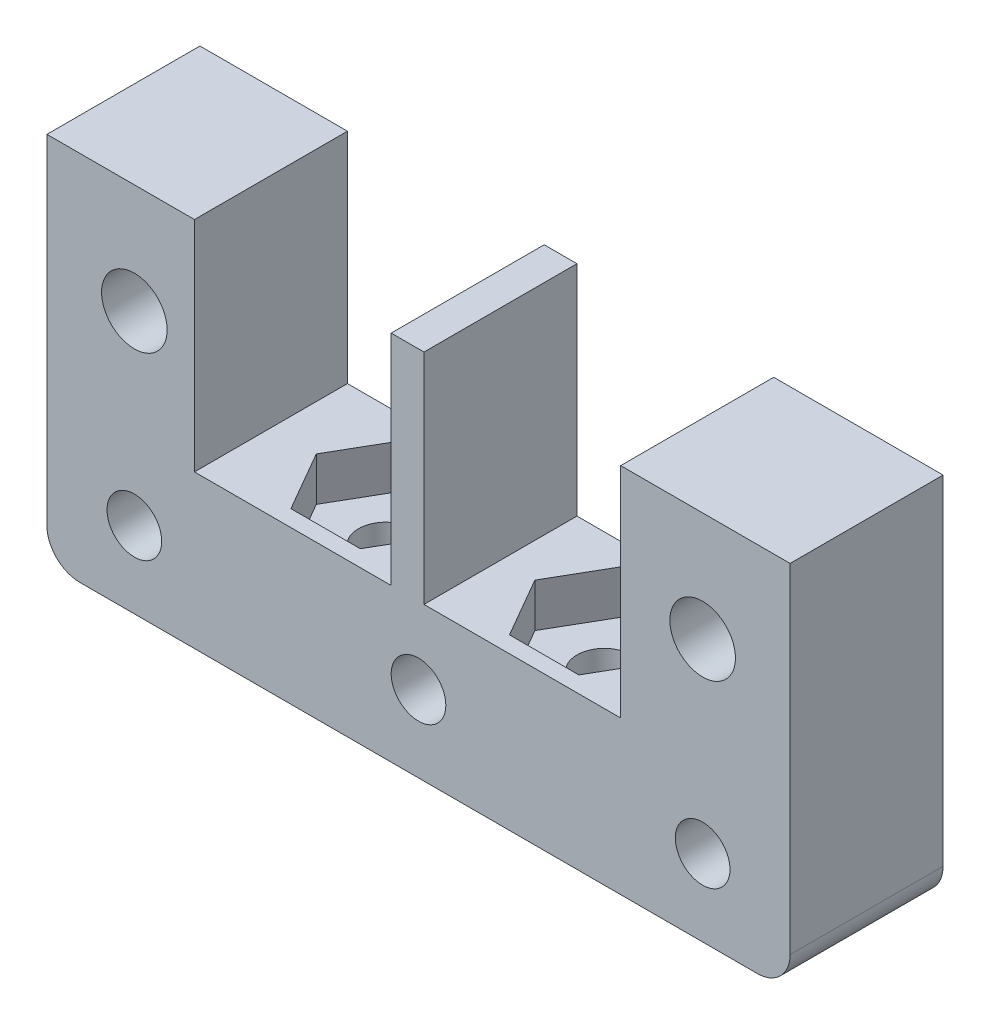
ISO-10303-21;
HEADER;
FILE_DESCRIPTION(('STEP AP214'),'2;1');
FILE_NAME('part.step','',(''),(''),'','','');
FILE_SCHEMA(('AUTOMOTIVE_DESIGN { 1 0 10303 214 1 1 1 1 }'));
ENDSEC;
DATA;
#1=APPLICATION_CONTEXT('core data for automotive mechanical design processes');
#2=APPLICATION_PROTOCOL_DEFINITION('international standard','automotive_design',2000,#1);
#3=PRODUCT_CONTEXT('',#1,'mechanical');
#4=PRODUCT('Part','Part','',(#3));
#5=PRODUCT_RELATED_PRODUCT_CATEGORY('part','',(#4));
#6=PRODUCT_DEFINITION_FORMATION('','',#4);
#7=PRODUCT_DEFINITION_CONTEXT('part definition',#1,'design');
#8=PRODUCT_DEFINITION('design','',#6,#7);
#9=PRODUCT_DEFINITION_SHAPE('','',#8);
#10=(LENGTH_UNIT() NAMED_UNIT(*) SI_UNIT(.MILLI.,.METRE.));
#11=(NAMED_UNIT(*) PLANE_ANGLE_UNIT() SI_UNIT($,.RADIAN.));
#12=(NAMED_UNIT(*) SI_UNIT($,.STERADIAN.) SOLID_ANGLE_UNIT());
#13=UNCERTAINTY_MEASURE_WITH_UNIT(LENGTH_MEASURE(1.E-05),#10,'distance_accuracy_value','');
#14=(GEOMETRIC_REPRESENTATION_CONTEXT(3) GLOBAL_UNCERTAINTY_ASSIGNED_CONTEXT((#13)) GLOBAL_UNIT_ASSIGNED_CONTEXT((#10,
#11,#12)) REPRESENTATION_CONTEXT('',''));
#15=CARTESIAN_POINT('',(0.,0.,0.));
#16=DIRECTION('',(0.,0.,1.));
#17=DIRECTION('',(1.,0.,0.));
#18=AXIS2_PLACEMENT_3D('',#15,#16,#17);
#19=CARTESIAN_POINT('',(12.,10.,3.5));
#20=DIRECTION('',(0.,-1.,0.));
#21=DIRECTION('',(0.,0.,-1.));
#22=AXIS2_PLACEMENT_3D('',#19,#20,#21);
#23=CYLINDRICAL_SURFACE('',#22,1.25);
#24=CARTESIAN_POINT('',(12.,0.,3.5));
#25=DIRECTION('',(0.,-1.,0.));
#26=DIRECTION('',(0.,0.,-1.));
#27=AXIS2_PLACEMENT_3D('',#24,#25,#26);
#28=CIRCLE('',#27,1.25);
#29=CARTESIAN_POINT('',(12.,0.,2.25));
#30=VERTEX_POINT('',#29);
#31=EDGE_CURVE('E399',#30,#30,#28,.T.);
#32=ORIENTED_EDGE('',*,*,#31,.T.);
#33=EDGE_LOOP('',(#32));
#34=FACE_BOUND('',#33,.T.);
#35=CARTESIAN_POINT('',(12.,5.,3.5));
#36=DIRECTION('',(0.,1.,0.));
#37=DIRECTION('',(0.,0.,1.));
#38=AXIS2_PLACEMENT_3D('',#35,#36,#37);
#39=CIRCLE('',#38,1.25);
#40=CARTESIAN_POINT('',(12.,5.,4.75));
#41=VERTEX_POINT('',#40);
#42=EDGE_CURVE('E346',#41,#41,#39,.F.);
#43=ORIENTED_EDGE('',*,*,#42,.F.);
#44=EDGE_LOOP('',(#43));
#45=FACE_BOUND('',#44,.T.);
#46=ADVANCED_FACE('F45',(#34,#45),#23,.F.);
#47=CARTESIAN_POINT('',(22.,10.,3.5));
#48=DIRECTION('',(0.,-1.,0.));
#49=DIRECTION('',(0.,0.,-1.));
#50=AXIS2_PLACEMENT_3D('',#47,#48,#49);
#51=CYLINDRICAL_SURFACE('',#50,1.25);
#52=CARTESIAN_POINT('',(22.,0.,3.5));
#53=DIRECTION('',(0.,-1.,0.));
#54=DIRECTION('',(0.,0.,-1.));
#55=AXIS2_PLACEMENT_3D('',#52,#53,#54);
#56=CIRCLE('',#55,1.25);
#57=CARTESIAN_POINT('',(22.,0.,2.25));
#58=VERTEX_POINT('',#57);
#59=EDGE_CURVE('E400',#58,#58,#56,.T.);
#60=ORIENTED_EDGE('',*,*,#59,.T.);
#61=EDGE_LOOP('',(#60));
#62=FACE_BOUND('',#61,.T.);
#63=CARTESIAN_POINT('',(22.,5.,3.5));
#64=DIRECTION('',(0.,1.,0.));
#65=DIRECTION('',(0.,0.,1.));
#66=AXIS2_PLACEMENT_3D('',#63,#64,#65);
#67=CIRCLE('',#66,1.25);
#68=CARTESIAN_POINT('',(22.,5.,4.75));
#69=VERTEX_POINT('',#68);
#70=EDGE_CURVE('E276',#69,#69,#67,.F.);
#71=ORIENTED_EDGE('',*,*,#70,.F.);
#72=EDGE_LOOP('',(#71));
#73=FACE_BOUND('',#72,.T.);
#74=ADVANCED_FACE('F525',(#62,#73),#51,.F.);
#75=CARTESIAN_POINT('',(0.,7.,7.));
#76=DIRECTION('',(0.,-1.,0.));
#77=DIRECTION('',(0.,0.,-1.));
#78=AXIS2_PLACEMENT_3D('',#75,#76,#77);
#79=PLANE('',#78);
#80=DIRECTION('',(-0.500000000000001,0.,-0.866025403784438));
#81=VECTOR('',#80,1.);
#82=CARTESIAN_POINT('',(25.1754264805429,7.,3.5));
#83=LINE('',#82,#81);
#84=CARTESIAN_POINT('',(25.1754264805429,7.,3.5));
#85=VERTEX_POINT('',#84);
#86=CARTESIAN_POINT('',(23.5877132402715,7.,0.749999999999997));
#87=VERTEX_POINT('',#86);
#88=EDGE_CURVE('E306',#85,#87,#83,.T.);
#89=ORIENTED_EDGE('',*,*,#88,.F.);
#90=DIRECTION('',(0.5,0.,-0.866025403784438));
#91=VECTOR('',#90,1.);
#92=CARTESIAN_POINT('',(23.5877132402715,7.,6.25));
#93=LINE('',#92,#91);
#94=CARTESIAN_POINT('',(23.5877132402715,7.,6.25));
#95=VERTEX_POINT('',#94);
#96=EDGE_CURVE('E304',#95,#85,#93,.T.);
#97=ORIENTED_EDGE('',*,*,#96,.F.);
#98=DIRECTION('',(1.,0.,0.));
#99=VECTOR('',#98,1.);
#100=CARTESIAN_POINT('',(20.4122867597285,7.,6.25));
#101=LINE('',#100,#99);
#102=CARTESIAN_POINT('',(20.4122867597285,7.,6.25));
#103=VERTEX_POINT('',#102);
#104=EDGE_CURVE('E288',#103,#95,#101,.T.);
#105=ORIENTED_EDGE('',*,*,#104,.F.);
#106=DIRECTION('',(0.5,0.,0.866025403784438));
#107=VECTOR('',#106,1.);
#108=CARTESIAN_POINT('',(18.8245735194571,7.,3.5));
#109=LINE('',#108,#107);
#110=CARTESIAN_POINT('',(18.8245735194571,7.,3.5));
#111=VERTEX_POINT('',#110);
#112=EDGE_CURVE('E315',#111,#103,#109,.T.);
#113=ORIENTED_EDGE('',*,*,#112,.F.);
#114=DIRECTION('',(-0.5,0.,0.866025403784439));
#115=VECTOR('',#114,1.);
#116=CARTESIAN_POINT('',(20.4122867597285,7.,0.749999999999998));
#117=LINE('',#116,#115);
#118=CARTESIAN_POINT('',(20.4122867597285,7.,0.749999999999998));
#119=VERTEX_POINT('',#118);
#120=EDGE_CURVE('E312',#119,#111,#117,.T.);
#121=ORIENTED_EDGE('',*,*,#120,.F.);
#122=DIRECTION('',(-1.,0.,0.));
#123=VECTOR('',#122,1.);
#124=CARTESIAN_POINT('',(23.5877132402715,7.,0.749999999999997));
#125=LINE('',#124,#123);
#126=EDGE_CURVE('E309',#87,#119,#125,.T.);
#127=ORIENTED_EDGE('',*,*,#126,.F.);
#128=EDGE_LOOP('',(#89,#97,#105,#113,#121,#127));
#129=FACE_BOUND('',#128,.T.);
#130=DIRECTION('',(0.,0.,1.));
#131=VECTOR('',#130,1.);
#132=CARTESIAN_POINT('',(26.25,7.,0.));
#133=LINE('',#132,#131);
#134=CARTESIAN_POINT('',(26.25,7.,0.));
#135=VERTEX_POINT('',#134);
#136=CARTESIAN_POINT('',(26.25,7.,7.));
#137=VERTEX_POINT('',#136);
#138=EDGE_CURVE('E335',#135,#137,#133,.T.);
#139=ORIENTED_EDGE('',*,*,#138,.F.);
#140=DIRECTION('',(-1.,0.,0.));
#141=VECTOR('',#140,1.);
#142=CARTESIAN_POINT('',(0.,7.,0.));
#143=LINE('',#142,#141);
#144=CARTESIAN_POINT('',(17.25,7.,0.));
#145=VERTEX_POINT('',#144);
#146=EDGE_CURVE('E427',#135,#145,#143,.T.);
#147=ORIENTED_EDGE('',*,*,#146,.T.);
#148=DIRECTION('',(0.,0.,-1.));
#149=VECTOR('',#148,1.);
#150=CARTESIAN_POINT('',(17.25,7.,7.));
#151=LINE('',#150,#149);
#152=CARTESIAN_POINT('',(17.25,7.,7.));
#153=VERTEX_POINT('',#152);
#154=EDGE_CURVE('E357',#153,#145,#151,.T.);
#155=ORIENTED_EDGE('',*,*,#154,.F.);
#156=DIRECTION('',(-1.,0.,0.));
#157=VECTOR('',#156,1.);
#158=CARTESIAN_POINT('',(0.,7.,7.));
#159=LINE('',#158,#157);
#160=EDGE_CURVE('E432',#137,#153,#159,.T.);
#161=ORIENTED_EDGE('',*,*,#160,.F.);
#162=EDGE_LOOP('',(#139,#147,#155,#161));
#163=FACE_BOUND('',#162,.T.);
#164=ADVANCED_FACE('F501',(#129,#163),#79,.F.);
#165=DIRECTION('',(-0.5,0.,-0.866025403784439));
#166=VECTOR('',#165,1.);
#167=CARTESIAN_POINT('',(15.1754264805429,7.,3.49999999999999));
#168=LINE('',#167,#166);
#169=CARTESIAN_POINT('',(15.1754264805429,7.,3.49999999999999));
#170=VERTEX_POINT('',#169);
#171=CARTESIAN_POINT('',(13.5877132402715,7.,0.749999999999999));
#172=VERTEX_POINT('',#171);
#173=EDGE_CURVE('E263',#170,#172,#168,.T.);
#174=ORIENTED_EDGE('',*,*,#173,.F.);
#175=DIRECTION('',(0.5,0.,-0.866025403784439));
#176=VECTOR('',#175,1.);
#177=CARTESIAN_POINT('',(13.5877132402715,7.,6.25));
#178=LINE('',#177,#176);
#179=CARTESIAN_POINT('',(13.5877132402715,7.,6.25));
#180=VERTEX_POINT('',#179);
#181=EDGE_CURVE('E227',#180,#170,#178,.T.);
#182=ORIENTED_EDGE('',*,*,#181,.F.);
#183=DIRECTION('',(1.,0.,0.));
#184=VECTOR('',#183,1.);
#185=CARTESIAN_POINT('',(10.4122867597285,7.,6.25));
#186=LINE('',#185,#184);
#187=CARTESIAN_POINT('',(10.4122867597285,7.,6.25));
#188=VERTEX_POINT('',#187);
#189=EDGE_CURVE('E246',#188,#180,#186,.T.);
#190=ORIENTED_EDGE('',*,*,#189,.F.);
#191=DIRECTION('',(0.5,0.,0.866025403784439));
#192=VECTOR('',#191,1.);
#193=CARTESIAN_POINT('',(8.82457351945707,7.,3.5));
#194=LINE('',#193,#192);
#195=CARTESIAN_POINT('',(8.82457351945707,7.,3.5));
#196=VERTEX_POINT('',#195);
#197=EDGE_CURVE('E249',#196,#188,#194,.T.);
#198=ORIENTED_EDGE('',*,*,#197,.F.);
#199=DIRECTION('',(-0.499999999999999,0.,0.866025403784439));
#200=VECTOR('',#199,1.);
#201=CARTESIAN_POINT('',(10.4122867597285,7.,0.75));
#202=LINE('',#201,#200);
#203=CARTESIAN_POINT('',(10.4122867597285,7.,0.75));
#204=VERTEX_POINT('',#203);
#205=EDGE_CURVE('E269',#204,#196,#202,.T.);
#206=ORIENTED_EDGE('',*,*,#205,.F.);
#207=DIRECTION('',(-1.,0.,0.));
#208=VECTOR('',#207,1.);
#209=CARTESIAN_POINT('',(13.5877132402715,7.,0.749999999999999));
#210=LINE('',#209,#208);
#211=EDGE_CURVE('E266',#172,#204,#210,.T.);
#212=ORIENTED_EDGE('',*,*,#211,.F.);
#213=EDGE_LOOP('',(#174,#182,#190,#198,#206,#212));
#214=FACE_BOUND('',#213,.T.);
#215=DIRECTION('',(0.,0.,1.));
#216=VECTOR('',#215,1.);
#217=CARTESIAN_POINT('',(15.75,7.,7.));
#218=LINE('',#217,#216);
#219=CARTESIAN_POINT('',(15.75,7.,0.));
#220=VERTEX_POINT('',#219);
#221=CARTESIAN_POINT('',(15.75,7.,7.));
#222=VERTEX_POINT('',#221);
#223=EDGE_CURVE('E352',#220,#222,#218,.T.);
#224=ORIENTED_EDGE('',*,*,#223,.F.);
#225=CARTESIAN_POINT('',(6.75,7.,0.));
#226=VERTEX_POINT('',#225);
#227=EDGE_CURVE('E441',#220,#226,#143,.T.);
#228=ORIENTED_EDGE('',*,*,#227,.T.);
#229=DIRECTION('',(0.,0.,-1.));
#230=VECTOR('',#229,1.);
#231=CARTESIAN_POINT('',(6.75,7.,0.));
#232=LINE('',#231,#230);
#233=CARTESIAN_POINT('',(6.75,7.,7.));
#234=VERTEX_POINT('',#233);
#235=EDGE_CURVE('E379',#234,#226,#232,.T.);
#236=ORIENTED_EDGE('',*,*,#235,.F.);
#237=EDGE_CURVE('E431',#222,#234,#159,.T.);
#238=ORIENTED_EDGE('',*,*,#237,.F.);
#239=EDGE_LOOP('',(#224,#228,#236,#238));
#240=FACE_BOUND('',#239,.T.);
#241=ADVANCED_FACE('F486',(#214,#240),#79,.F.);
#242=CARTESIAN_POINT('',(0.,0.,7.));
#243=DIRECTION('',(0.,0.,1.));
#244=DIRECTION('',(1.,0.,0.));
#245=AXIS2_PLACEMENT_3D('',#242,#243,#244);
#246=PLANE('',#245);
#247=CARTESIAN_POINT('',(30.,12.,7.));
#248=DIRECTION('',(0.,0.,1.));
#249=DIRECTION('',(1.,0.,0.));
#250=AXIS2_PLACEMENT_3D('',#247,#248,#249);
#251=CIRCLE('',#250,1.5);
#252=CARTESIAN_POINT('',(31.5,12.,7.));
#253=VERTEX_POINT('',#252);
#254=EDGE_CURVE('E252',#253,#253,#251,.T.);
#255=ORIENTED_EDGE('',*,*,#254,.F.);
#256=EDGE_LOOP('',(#255));
#257=FACE_BOUND('',#256,.T.);
#258=CARTESIAN_POINT('',(4.,12.,7.));
#259=DIRECTION('',(0.,0.,1.));
#260=DIRECTION('',(1.,0.,0.));
#261=AXIS2_PLACEMENT_3D('',#258,#259,#260);
#262=CIRCLE('',#261,1.5);
#263=CARTESIAN_POINT('',(5.5,12.,7.));
#264=VERTEX_POINT('',#263);
#265=EDGE_CURVE('E781',#264,#264,#262,.T.);
#266=ORIENTED_EDGE('',*,*,#265,.F.);
#267=EDGE_LOOP('',(#266));
#268=FACE_BOUND('',#267,.T.);
#269=CARTESIAN_POINT('',(30.,3.50000000000001,7.));
#270=DIRECTION('',(0.,0.,1.));
#271=DIRECTION('',(1.,0.,0.));
#272=AXIS2_PLACEMENT_3D('',#269,#270,#271);
#273=CIRCLE('',#272,1.25);
#274=CARTESIAN_POINT('',(31.25,3.50000000000001,7.));
#275=VERTEX_POINT('',#274);
#276=EDGE_CURVE('E412',#275,#275,#273,.T.);
#277=ORIENTED_EDGE('',*,*,#276,.F.);
#278=EDGE_LOOP('',(#277));
#279=FACE_BOUND('',#278,.T.);
#280=DIRECTION('',(0.,-1.,0.));
#281=VECTOR('',#280,1.);
#282=CARTESIAN_POINT('',(0.,7.,7.));
#283=LINE('',#282,#281);
#284=CARTESIAN_POINT('',(0.,17.,7.));
#285=VERTEX_POINT('',#284);
#286=CARTESIAN_POINT('',(0.,1.5,7.));
#287=VERTEX_POINT('',#286);
#288=EDGE_CURVE('E424',#285,#287,#283,.T.);
#289=ORIENTED_EDGE('',*,*,#288,.T.);
#290=CARTESIAN_POINT('',(1.5,1.5,7.));
#291=DIRECTION('',(0.,0.,1.));
#292=DIRECTION('',(1.,0.,0.));
#293=AXIS2_PLACEMENT_3D('',#290,#291,#292);
#294=CIRCLE('',#293,1.5);
#295=CARTESIAN_POINT('',(1.5,0.,7.));
#296=VERTEX_POINT('',#295);
#297=EDGE_CURVE('E53',#287,#296,#294,.T.);
#298=ORIENTED_EDGE('',*,*,#297,.T.);
#299=DIRECTION('',(1.,0.,0.));
#300=VECTOR('',#299,1.);
#301=CARTESIAN_POINT('',(0.,0.,7.));
#302=LINE('',#301,#300);
#303=CARTESIAN_POINT('',(32.5,0.,7.));
#304=VERTEX_POINT('',#303);
#305=EDGE_CURVE('E426',#296,#304,#302,.T.);
#306=ORIENTED_EDGE('',*,*,#305,.T.);
#307=CARTESIAN_POINT('',(32.5,1.5,7.));
#308=DIRECTION('',(0.,0.,1.));
#309=DIRECTION('',(1.,0.,0.));
#310=AXIS2_PLACEMENT_3D('',#307,#308,#309);
#311=CIRCLE('',#310,1.5);
#312=CARTESIAN_POINT('',(34.,1.5,7.));
#313=VERTEX_POINT('',#312);
#314=EDGE_CURVE('E60',#304,#313,#311,.T.);
#315=ORIENTED_EDGE('',*,*,#314,.T.);
#316=DIRECTION('',(0.,1.,0.));
#317=VECTOR('',#316,1.);
#318=CARTESIAN_POINT('',(34.,0.,7.));
#319=LINE('',#318,#317);
#320=CARTESIAN_POINT('',(34.,17.,7.00000000000004));
#321=VERTEX_POINT('',#320);
#322=EDGE_CURVE('E429',#313,#321,#319,.T.);
#323=ORIENTED_EDGE('',*,*,#322,.T.);
#324=DIRECTION('',(1.,0.,0.));
#325=VECTOR('',#324,1.);
#326=CARTESIAN_POINT('',(26.25,17.,7.00000000000004));
#327=LINE('',#326,#325);
#328=CARTESIAN_POINT('',(26.25,17.,7.00000000000004));
#329=VERTEX_POINT('',#328);
#330=EDGE_CURVE('E334',#329,#321,#327,.T.);
#331=ORIENTED_EDGE('',*,*,#330,.F.);
#332=DIRECTION('',(0.,-1.,0.));
#333=VECTOR('',#332,1.);
#334=CARTESIAN_POINT('',(26.25,17.,7.00000000000004));
#335=LINE('',#334,#333);
#336=EDGE_CURVE('E349',#329,#137,#335,.T.);
#337=ORIENTED_EDGE('',*,*,#336,.T.);
#338=ORIENTED_EDGE('',*,*,#160,.T.);
#339=DIRECTION('',(0.,-1.,0.));
#340=VECTOR('',#339,1.);
#341=CARTESIAN_POINT('',(17.25,17.,7.));
#342=LINE('',#341,#340);
#343=CARTESIAN_POINT('',(17.25,17.,7.));
#344=VERTEX_POINT('',#343);
#345=EDGE_CURVE('E373',#344,#153,#342,.T.);
#346=ORIENTED_EDGE('',*,*,#345,.F.);
#347=DIRECTION('',(1.,0.,0.));
#348=VECTOR('',#347,1.);
#349=CARTESIAN_POINT('',(15.75,17.,7.));
#350=LINE('',#349,#348);
#351=CARTESIAN_POINT('',(15.75,17.,7.));
#352=VERTEX_POINT('',#351);
#353=EDGE_CURVE('E356',#352,#344,#350,.T.);
#354=ORIENTED_EDGE('',*,*,#353,.F.);
#355=DIRECTION('',(0.,-1.,0.));
#356=VECTOR('',#355,1.);
#357=CARTESIAN_POINT('',(15.75,17.,7.));
#358=LINE('',#357,#356);
#359=EDGE_CURVE('E376',#352,#222,#358,.T.);
#360=ORIENTED_EDGE('',*,*,#359,.T.);
#361=ORIENTED_EDGE('',*,*,#237,.T.);
#362=DIRECTION('',(0.,-1.,0.));
#363=VECTOR('',#362,1.);
#364=CARTESIAN_POINT('',(6.75000000000001,17.,7.));
#365=LINE('',#364,#363);
#366=CARTESIAN_POINT('',(6.75000000000001,17.,7.));
#367=VERTEX_POINT('',#366);
#368=EDGE_CURVE('E391',#367,#234,#365,.T.);
#369=ORIENTED_EDGE('',*,*,#368,.F.);
#370=DIRECTION('',(1.,0.,0.));
#371=VECTOR('',#370,1.);
#372=CARTESIAN_POINT('',(6.75000000000001,17.,7.));
#373=LINE('',#372,#371);
#374=EDGE_CURVE('E389',#285,#367,#373,.T.);
#375=ORIENTED_EDGE('',*,*,#374,.F.);
#376=EDGE_LOOP('',(#289,#298,#306,#315,#323,#331,#337,#338,#346,#354,#360,#361,#369,#375));
#377=FACE_BOUND('',#376,.T.);
#378=CARTESIAN_POINT('',(4.,3.5,7.));
#379=DIRECTION('',(0.,0.,1.));
#380=DIRECTION('',(1.,0.,0.));
#381=AXIS2_PLACEMENT_3D('',#378,#379,#380);
#382=CIRCLE('',#381,1.25);
#383=CARTESIAN_POINT('',(5.25,3.5,7.));
#384=VERTEX_POINT('',#383);
#385=EDGE_CURVE('E418',#384,#384,#382,.T.);
#386=ORIENTED_EDGE('',*,*,#385,.F.);
#387=EDGE_LOOP('',(#386));
#388=FACE_BOUND('',#387,.T.);
#389=CARTESIAN_POINT('',(17.,3.5,7.));
#390=DIRECTION('',(0.,0.,1.));
#391=DIRECTION('',(1.,0.,0.));
#392=AXIS2_PLACEMENT_3D('',#389,#390,#391);
#393=CIRCLE('',#392,1.25);
#394=CARTESIAN_POINT('',(18.25,3.5,7.));
#395=VERTEX_POINT('',#394);
#396=EDGE_CURVE('E406',#395,#395,#393,.T.);
#397=ORIENTED_EDGE('',*,*,#396,.F.);
#398=EDGE_LOOP('',(#397));
#399=FACE_BOUND('',#398,.T.);
#400=ADVANCED_FACE('F458',(#257,#268,#279,#377,#388,#399),#246,.T.);
#401=CARTESIAN_POINT('',(0.,0.,0.));
#402=DIRECTION('',(0.,0.,1.));
#403=DIRECTION('',(1.,0.,0.));
#404=AXIS2_PLACEMENT_3D('',#401,#402,#403);
#405=PLANE('',#404);
#406=CARTESIAN_POINT('',(30.,12.,0.));
#407=DIRECTION('',(0.,0.,-1.));
#408=DIRECTION('',(-1.,0.,0.));
#409=AXIS2_PLACEMENT_3D('',#406,#407,#408);
#410=CIRCLE('',#409,1.5);
#411=CARTESIAN_POINT('',(28.5,12.,0.));
#412=VERTEX_POINT('',#411);
#413=EDGE_CURVE('E780',#412,#412,#410,.T.);
#414=ORIENTED_EDGE('',*,*,#413,.F.);
#415=EDGE_LOOP('',(#414));
#416=FACE_BOUND('',#415,.T.);
#417=CARTESIAN_POINT('',(4.,12.,0.));
#418=DIRECTION('',(0.,0.,-1.));
#419=DIRECTION('',(-1.,0.,0.));
#420=AXIS2_PLACEMENT_3D('',#417,#418,#419);
#421=CIRCLE('',#420,1.5);
#422=CARTESIAN_POINT('',(2.5,12.,0.));
#423=VERTEX_POINT('',#422);
#424=EDGE_CURVE('E782',#423,#423,#421,.T.);
#425=ORIENTED_EDGE('',*,*,#424,.F.);
#426=EDGE_LOOP('',(#425));
#427=FACE_BOUND('',#426,.T.);
#428=DIRECTION('',(1.,0.,0.));
#429=VECTOR('',#428,1.);
#430=CARTESIAN_POINT('',(0.,0.,0.));
#431=LINE('',#430,#429);
#432=CARTESIAN_POINT('',(1.5,0.,0.));
#433=VERTEX_POINT('',#432);
#434=CARTESIAN_POINT('',(32.5,0.,0.));
#435=VERTEX_POINT('',#434);
#436=EDGE_CURVE('E436',#433,#435,#431,.T.);
#437=ORIENTED_EDGE('',*,*,#436,.F.);
#438=CARTESIAN_POINT('',(1.5,1.5,0.));
#439=DIRECTION('',(0.,0.,1.));
#440=DIRECTION('',(1.,0.,0.));
#441=AXIS2_PLACEMENT_3D('',#438,#439,#440);
#442=CIRCLE('',#441,1.5);
#443=CARTESIAN_POINT('',(0.,1.5,0.));
#444=VERTEX_POINT('',#443);
#445=EDGE_CURVE('E453',#433,#444,#442,.F.);
#446=ORIENTED_EDGE('',*,*,#445,.T.);
#447=DIRECTION('',(0.,-1.,0.));
#448=VECTOR('',#447,1.);
#449=CARTESIAN_POINT('',(0.,7.,0.));
#450=LINE('',#449,#448);
#451=CARTESIAN_POINT('',(0.,17.,0.));
#452=VERTEX_POINT('',#451);
#453=EDGE_CURVE('E421',#452,#444,#450,.T.);
#454=ORIENTED_EDGE('',*,*,#453,.F.);
#455=DIRECTION('',(-1.,0.,0.));
#456=VECTOR('',#455,1.);
#457=CARTESIAN_POINT('',(6.75,17.,0.));
#458=LINE('',#457,#456);
#459=CARTESIAN_POINT('',(6.75,17.,0.));
#460=VERTEX_POINT('',#459);
#461=EDGE_CURVE('E383',#460,#452,#458,.T.);
#462=ORIENTED_EDGE('',*,*,#461,.F.);
#463=DIRECTION('',(0.,-1.,0.));
#464=VECTOR('',#463,1.);
#465=CARTESIAN_POINT('',(6.75,17.,0.));
#466=LINE('',#465,#464);
#467=EDGE_CURVE('E396',#460,#226,#466,.T.);
#468=ORIENTED_EDGE('',*,*,#467,.T.);
#469=ORIENTED_EDGE('',*,*,#227,.F.);
#470=DIRECTION('',(0.,-1.,0.));
#471=VECTOR('',#470,1.);
#472=CARTESIAN_POINT('',(15.75,17.,0.));
#473=LINE('',#472,#471);
#474=CARTESIAN_POINT('',(15.75,17.,0.));
#475=VERTEX_POINT('',#474);
#476=EDGE_CURVE('E363',#475,#220,#473,.T.);
#477=ORIENTED_EDGE('',*,*,#476,.F.);
#478=DIRECTION('',(-1.,0.,0.));
#479=VECTOR('',#478,1.);
#480=CARTESIAN_POINT('',(15.75,17.,0.));
#481=LINE('',#480,#479);
#482=CARTESIAN_POINT('',(17.25,17.,0.));
#483=VERTEX_POINT('',#482);
#484=EDGE_CURVE('E361',#483,#475,#481,.T.);
#485=ORIENTED_EDGE('',*,*,#484,.F.);
#486=DIRECTION('',(0.,-1.,0.));
#487=VECTOR('',#486,1.);
#488=CARTESIAN_POINT('',(17.25,17.,0.));
#489=LINE('',#488,#487);
#490=EDGE_CURVE('E370',#483,#145,#489,.T.);
#491=ORIENTED_EDGE('',*,*,#490,.T.);
#492=ORIENTED_EDGE('',*,*,#146,.F.);
#493=DIRECTION('',(0.,-1.,0.));
#494=VECTOR('',#493,1.);
#495=CARTESIAN_POINT('',(26.25,17.,0.));
#496=LINE('',#495,#494);
#497=CARTESIAN_POINT('',(26.25,17.,0.));
#498=VERTEX_POINT('',#497);
#499=EDGE_CURVE('E343',#498,#135,#496,.T.);
#500=ORIENTED_EDGE('',*,*,#499,.F.);
#501=DIRECTION('',(-1.,0.,0.));
#502=VECTOR('',#501,1.);
#503=CARTESIAN_POINT('',(26.25,17.,0.));
#504=LINE('',#503,#502);
#505=CARTESIAN_POINT('',(34.,17.,0.));
#506=VERTEX_POINT('',#505);
#507=EDGE_CURVE('E341',#506,#498,#504,.T.);
#508=ORIENTED_EDGE('',*,*,#507,.F.);
#509=DIRECTION('',(0.,1.,0.));
#510=VECTOR('',#509,1.);
#511=CARTESIAN_POINT('',(34.,0.,0.));
#512=LINE('',#511,#510);
#513=CARTESIAN_POINT('',(34.,1.5,0.));
#514=VERTEX_POINT('',#513);
#515=EDGE_CURVE('E439',#514,#506,#512,.T.);
#516=ORIENTED_EDGE('',*,*,#515,.F.);
#517=CARTESIAN_POINT('',(32.5,1.5,0.));
#518=DIRECTION('',(0.,0.,1.));
#519=DIRECTION('',(1.,0.,0.));
#520=AXIS2_PLACEMENT_3D('',#517,#518,#519);
#521=CIRCLE('',#520,1.5);
#522=EDGE_CURVE('E451',#514,#435,#521,.F.);
#523=ORIENTED_EDGE('',*,*,#522,.T.);
#524=EDGE_LOOP('',(#437,#446,#454,#462,#468,#469,#477,#485,#491,#492,#500,#508,#516,#523));
#525=FACE_BOUND('',#524,.T.);
#526=CARTESIAN_POINT('',(4.,3.5,0.));
#527=DIRECTION('',(0.,0.,1.));
#528=DIRECTION('',(1.,0.,0.));
#529=AXIS2_PLACEMENT_3D('',#526,#527,#528);
#530=CIRCLE('',#529,1.25);
#531=CARTESIAN_POINT('',(5.25,3.5,0.));
#532=VERTEX_POINT('',#531);
#533=EDGE_CURVE('E415',#532,#532,#530,.T.);
#534=ORIENTED_EDGE('',*,*,#533,.T.);
#535=EDGE_LOOP('',(#534));
#536=FACE_BOUND('',#535,.T.);
#537=CARTESIAN_POINT('',(30.,3.50000000000001,0.));
#538=DIRECTION('',(0.,0.,1.));
#539=DIRECTION('',(1.,0.,0.));
#540=AXIS2_PLACEMENT_3D('',#537,#538,#539);
#541=CIRCLE('',#540,1.25);
#542=CARTESIAN_POINT('',(31.25,3.50000000000001,0.));
#543=VERTEX_POINT('',#542);
#544=EDGE_CURVE('E409',#543,#543,#541,.T.);
#545=ORIENTED_EDGE('',*,*,#544,.T.);
#546=EDGE_LOOP('',(#545));
#547=FACE_BOUND('',#546,.T.);
#548=CARTESIAN_POINT('',(17.,3.5,0.));
#549=DIRECTION('',(0.,0.,1.));
#550=DIRECTION('',(1.,0.,0.));
#551=AXIS2_PLACEMENT_3D('',#548,#549,#550);
#552=CIRCLE('',#551,1.25);
#553=CARTESIAN_POINT('',(18.25,3.5,0.));
#554=VERTEX_POINT('',#553);
#555=EDGE_CURVE('E403',#554,#554,#552,.T.);
#556=ORIENTED_EDGE('',*,*,#555,.T.);
#557=EDGE_LOOP('',(#556));
#558=FACE_BOUND('',#557,.T.);
#559=ADVANCED_FACE('F469',(#416,#427,#525,#536,#547,#558),#405,.F.);
#560=CARTESIAN_POINT('',(0.,7.,7.));
#561=DIRECTION('',(1.,0.,0.));
#562=DIRECTION('',(0.,0.,-1.));
#563=AXIS2_PLACEMENT_3D('',#560,#561,#562);
#564=PLANE('',#563);
#565=ORIENTED_EDGE('',*,*,#453,.T.);
#566=DIRECTION('',(0.,0.,-1.));
#567=VECTOR('',#566,1.);
#568=CARTESIAN_POINT('',(0.,1.5,7.));
#569=LINE('',#568,#567);
#570=EDGE_CURVE('E68',#444,#287,#569,.F.);
#571=ORIENTED_EDGE('',*,*,#570,.T.);
#572=ORIENTED_EDGE('',*,*,#288,.F.);
#573=DIRECTION('',(0.,0.,1.));
#574=VECTOR('',#573,1.);
#575=CARTESIAN_POINT('',(0.,17.,0.));
#576=LINE('',#575,#574);
#577=EDGE_CURVE('E386',#452,#285,#576,.T.);
#578=ORIENTED_EDGE('',*,*,#577,.F.);
#579=EDGE_LOOP('',(#565,#571,#572,#578));
#580=FACE_BOUND('',#579,.T.);
#581=ADVANCED_FACE('F472',(#580),#564,.F.);
#582=CARTESIAN_POINT('',(0.,0.,7.));
#583=DIRECTION('',(0.,1.,0.));
#584=DIRECTION('',(0.,0.,1.));
#585=AXIS2_PLACEMENT_3D('',#582,#583,#584);
#586=PLANE('',#585);
#587=ORIENTED_EDGE('',*,*,#59,.F.);
#588=EDGE_LOOP('',(#587));
#589=FACE_BOUND('',#588,.T.);
#590=ORIENTED_EDGE('',*,*,#31,.F.);
#591=EDGE_LOOP('',(#590));
#592=FACE_BOUND('',#591,.T.);
#593=ORIENTED_EDGE('',*,*,#305,.F.);
#594=DIRECTION('',(0.,0.,-1.));
#595=VECTOR('',#594,1.);
#596=CARTESIAN_POINT('',(1.5,0.,7.));
#597=LINE('',#596,#595);
#598=EDGE_CURVE('E448',#296,#433,#597,.T.);
#599=ORIENTED_EDGE('',*,*,#598,.T.);
#600=ORIENTED_EDGE('',*,*,#436,.T.);
#601=DIRECTION('',(0.,0.,-1.));
#602=VECTOR('',#601,1.);
#603=CARTESIAN_POINT('',(32.5,0.,7.));
#604=LINE('',#603,#602);
#605=EDGE_CURVE('E434',#435,#304,#604,.F.);
#606=ORIENTED_EDGE('',*,*,#605,.T.);
#607=EDGE_LOOP('',(#593,#599,#600,#606));
#608=FACE_BOUND('',#607,.T.);
#609=ADVANCED_FACE('F464',(#589,#592,#608),#586,.F.);
#610=CARTESIAN_POINT('',(34.,0.,7.));
#611=DIRECTION('',(-1.,0.,0.));
#612=DIRECTION('',(0.,0.,1.));
#613=AXIS2_PLACEMENT_3D('',#610,#611,#612);
#614=PLANE('',#613);
#615=ORIENTED_EDGE('',*,*,#322,.F.);
#616=DIRECTION('',(0.,0.,-1.));
#617=VECTOR('',#616,1.);
#618=CARTESIAN_POINT('',(34.,1.5,7.));
#619=LINE('',#618,#617);
#620=EDGE_CURVE('E13',#313,#514,#619,.T.);
#621=ORIENTED_EDGE('',*,*,#620,.T.);
#622=ORIENTED_EDGE('',*,*,#515,.T.);
#623=DIRECTION('',(0.,0.,-1.));
#624=VECTOR('',#623,1.);
#625=CARTESIAN_POINT('',(34.,17.,0.));
#626=LINE('',#625,#624);
#627=EDGE_CURVE('E338',#321,#506,#626,.T.);
#628=ORIENTED_EDGE('',*,*,#627,.F.);
#629=EDGE_LOOP('',(#615,#621,#622,#628));
#630=FACE_BOUND('',#629,.T.);
#631=ADVANCED_FACE('F512',(#630),#614,.F.);
#632=CARTESIAN_POINT('',(4.,3.5,7.));
#633=DIRECTION('',(0.,0.,-1.));
#634=DIRECTION('',(-1.,0.,0.));
#635=AXIS2_PLACEMENT_3D('',#632,#633,#634);
#636=CYLINDRICAL_SURFACE('',#635,1.25);
#637=ORIENTED_EDGE('',*,*,#385,.T.);
#638=EDGE_LOOP('',(#637));
#639=FACE_BOUND('',#638,.T.);
#640=ORIENTED_EDGE('',*,*,#533,.F.);
#641=EDGE_LOOP('',(#640));
#642=FACE_BOUND('',#641,.T.);
#643=ADVANCED_FACE('F543',(#639,#642),#636,.F.);
#644=CARTESIAN_POINT('',(30.,3.50000000000001,7.));
#645=DIRECTION('',(0.,0.,-1.));
#646=DIRECTION('',(-1.,0.,0.));
#647=AXIS2_PLACEMENT_3D('',#644,#645,#646);
#648=CYLINDRICAL_SURFACE('',#647,1.25);
#649=ORIENTED_EDGE('',*,*,#276,.T.);
#650=EDGE_LOOP('',(#649));
#651=FACE_BOUND('',#650,.T.);
#652=ORIENTED_EDGE('',*,*,#544,.F.);
#653=EDGE_LOOP('',(#652));
#654=FACE_BOUND('',#653,.T.);
#655=ADVANCED_FACE('F539',(#651,#654),#648,.F.);
#656=CARTESIAN_POINT('',(17.,3.5,7.));
#657=DIRECTION('',(0.,0.,-1.));
#658=DIRECTION('',(-1.,0.,0.));
#659=AXIS2_PLACEMENT_3D('',#656,#657,#658);
#660=CYLINDRICAL_SURFACE('',#659,1.25);
#661=ORIENTED_EDGE('',*,*,#396,.T.);
#662=EDGE_LOOP('',(#661));
#663=FACE_BOUND('',#662,.T.);
#664=ORIENTED_EDGE('',*,*,#555,.F.);
#665=EDGE_LOOP('',(#664));
#666=FACE_BOUND('',#665,.T.);
#667=ADVANCED_FACE('F536',(#663,#666),#660,.F.);
#668=CARTESIAN_POINT('',(6.75,17.,0.));
#669=DIRECTION('',(-1.,0.,0.));
#670=DIRECTION('',(0.,0.,1.));
#671=AXIS2_PLACEMENT_3D('',#668,#669,#670);
#672=PLANE('',#671);
#673=ORIENTED_EDGE('',*,*,#235,.T.);
#674=ORIENTED_EDGE('',*,*,#467,.F.);
#675=DIRECTION('',(0.,0.,-1.));
#676=VECTOR('',#675,1.);
#677=CARTESIAN_POINT('',(6.75,17.,0.));
#678=LINE('',#677,#676);
#679=EDGE_CURVE('E380',#367,#460,#678,.T.);
#680=ORIENTED_EDGE('',*,*,#679,.F.);
#681=ORIENTED_EDGE('',*,*,#368,.T.);
#682=EDGE_LOOP('',(#673,#674,#680,#681));
#683=FACE_BOUND('',#682,.T.);
#684=ADVANCED_FACE('F480',(#683),#672,.F.);
#685=CARTESIAN_POINT('',(0.,17.,0.));
#686=DIRECTION('',(0.,-1.,0.));
#687=DIRECTION('',(0.,0.,-1.));
#688=AXIS2_PLACEMENT_3D('',#685,#686,#687);
#689=PLANE('',#688);
#690=ORIENTED_EDGE('',*,*,#679,.T.);
#691=ORIENTED_EDGE('',*,*,#461,.T.);
#692=ORIENTED_EDGE('',*,*,#577,.T.);
#693=ORIENTED_EDGE('',*,*,#374,.T.);
#694=EDGE_LOOP('',(#690,#691,#692,#693));
#695=FACE_BOUND('',#694,.T.);
#696=ADVANCED_FACE('F474',(#695),#689,.F.);
#697=CARTESIAN_POINT('',(15.75,17.,7.));
#698=DIRECTION('',(1.,0.,0.));
#699=DIRECTION('',(0.,0.,-1.));
#700=AXIS2_PLACEMENT_3D('',#697,#698,#699);
#701=PLANE('',#700);
#702=ORIENTED_EDGE('',*,*,#223,.T.);
#703=ORIENTED_EDGE('',*,*,#359,.F.);
#704=DIRECTION('',(0.,0.,1.));
#705=VECTOR('',#704,1.);
#706=CARTESIAN_POINT('',(15.75,17.,7.));
#707=LINE('',#706,#705);
#708=EDGE_CURVE('E353',#475,#352,#707,.T.);
#709=ORIENTED_EDGE('',*,*,#708,.F.);
#710=ORIENTED_EDGE('',*,*,#476,.T.);
#711=EDGE_LOOP('',(#702,#703,#709,#710));
#712=FACE_BOUND('',#711,.T.);
#713=ADVANCED_FACE('F489',(#712),#701,.F.);
#714=CARTESIAN_POINT('',(17.25,17.,7.));
#715=DIRECTION('',(-1.,0.,0.));
#716=DIRECTION('',(0.,0.,1.));
#717=AXIS2_PLACEMENT_3D('',#714,#715,#716);
#718=PLANE('',#717);
#719=ORIENTED_EDGE('',*,*,#154,.T.);
#720=ORIENTED_EDGE('',*,*,#490,.F.);
#721=DIRECTION('',(0.,0.,-1.));
#722=VECTOR('',#721,1.);
#723=CARTESIAN_POINT('',(17.25,17.,7.));
#724=LINE('',#723,#722);
#725=EDGE_CURVE('E359',#344,#483,#724,.T.);
#726=ORIENTED_EDGE('',*,*,#725,.F.);
#727=ORIENTED_EDGE('',*,*,#345,.T.);
#728=EDGE_LOOP('',(#719,#720,#726,#727));
#729=FACE_BOUND('',#728,.T.);
#730=ADVANCED_FACE('F498',(#729),#718,.F.);
#731=CARTESIAN_POINT('',(0.,17.,0.));
#732=DIRECTION('',(0.,-1.,0.));
#733=DIRECTION('',(0.,0.,-1.));
#734=AXIS2_PLACEMENT_3D('',#731,#732,#733);
#735=PLANE('',#734);
#736=ORIENTED_EDGE('',*,*,#708,.T.);
#737=ORIENTED_EDGE('',*,*,#353,.T.);
#738=ORIENTED_EDGE('',*,*,#725,.T.);
#739=ORIENTED_EDGE('',*,*,#484,.T.);
#740=EDGE_LOOP('',(#736,#737,#738,#739));
#741=FACE_BOUND('',#740,.T.);
#742=ADVANCED_FACE('F491',(#741),#735,.F.);
#743=CARTESIAN_POINT('',(26.25,17.,0.));
#744=DIRECTION('',(1.,0.,0.));
#745=DIRECTION('',(0.,0.,-1.));
#746=AXIS2_PLACEMENT_3D('',#743,#744,#745);
#747=PLANE('',#746);
#748=ORIENTED_EDGE('',*,*,#138,.T.);
#749=ORIENTED_EDGE('',*,*,#336,.F.);
#750=DIRECTION('',(0.,0.,1.));
#751=VECTOR('',#750,1.);
#752=CARTESIAN_POINT('',(26.25,17.,0.));
#753=LINE('',#752,#751);
#754=EDGE_CURVE('E331',#498,#329,#753,.T.);
#755=ORIENTED_EDGE('',*,*,#754,.F.);
#756=ORIENTED_EDGE('',*,*,#499,.T.);
#757=EDGE_LOOP('',(#748,#749,#755,#756));
#758=FACE_BOUND('',#757,.T.);
#759=ADVANCED_FACE('F504',(#758),#747,.F.);
#760=CARTESIAN_POINT('',(0.,17.,0.));
#761=DIRECTION('',(0.,1.,0.));
#762=DIRECTION('',(0.,0.,1.));
#763=AXIS2_PLACEMENT_3D('',#760,#761,#762);
#764=PLANE('',#763);
#765=ORIENTED_EDGE('',*,*,#754,.T.);
#766=ORIENTED_EDGE('',*,*,#330,.T.);
#767=ORIENTED_EDGE('',*,*,#627,.T.);
#768=ORIENTED_EDGE('',*,*,#507,.T.);
#769=EDGE_LOOP('',(#765,#766,#767,#768));
#770=FACE_BOUND('',#769,.T.);
#771=ADVANCED_FACE('F509',(#770),#764,.T.);
#772=CARTESIAN_POINT('',(0.,5.,0.));
#773=DIRECTION('',(0.,1.,0.));
#774=DIRECTION('',(0.,0.,1.));
#775=AXIS2_PLACEMENT_3D('',#772,#773,#774);
#776=PLANE('',#775);
#777=DIRECTION('',(0.5,0.,-0.866025403784438));
#778=VECTOR('',#777,1.);
#779=CARTESIAN_POINT('',(23.5877132402715,5.,6.25));
#780=LINE('',#779,#778);
#781=CARTESIAN_POINT('',(23.5877132402715,5.,6.25));
#782=VERTEX_POINT('',#781);
#783=CARTESIAN_POINT('',(25.1754264805429,5.,3.5));
#784=VERTEX_POINT('',#783);
#785=EDGE_CURVE('E284',#782,#784,#780,.T.);
#786=ORIENTED_EDGE('',*,*,#785,.T.);
#787=DIRECTION('',(-0.500000000000001,0.,-0.866025403784438));
#788=VECTOR('',#787,1.);
#789=CARTESIAN_POINT('',(25.1754264805429,5.,3.5));
#790=LINE('',#789,#788);
#791=CARTESIAN_POINT('',(23.5877132402715,5.,0.749999999999997));
#792=VERTEX_POINT('',#791);
#793=EDGE_CURVE('E287',#784,#792,#790,.T.);
#794=ORIENTED_EDGE('',*,*,#793,.T.);
#795=DIRECTION('',(-1.,0.,0.));
#796=VECTOR('',#795,1.);
#797=CARTESIAN_POINT('',(23.5877132402715,5.,0.749999999999997));
#798=LINE('',#797,#796);
#799=CARTESIAN_POINT('',(20.4122867597285,5.,0.749999999999998));
#800=VERTEX_POINT('',#799);
#801=EDGE_CURVE('E291',#792,#800,#798,.T.);
#802=ORIENTED_EDGE('',*,*,#801,.T.);
#803=DIRECTION('',(-0.5,0.,0.866025403784439));
#804=VECTOR('',#803,1.);
#805=CARTESIAN_POINT('',(20.4122867597285,5.,0.749999999999998));
#806=LINE('',#805,#804);
#807=CARTESIAN_POINT('',(18.8245735194571,5.,3.5));
#808=VERTEX_POINT('',#807);
#809=EDGE_CURVE('E294',#800,#808,#806,.T.);
#810=ORIENTED_EDGE('',*,*,#809,.T.);
#811=DIRECTION('',(0.5,0.,0.866025403784438));
#812=VECTOR('',#811,1.);
#813=CARTESIAN_POINT('',(18.8245735194571,5.,3.5));
#814=LINE('',#813,#812);
#815=CARTESIAN_POINT('',(20.4122867597285,5.,6.25));
#816=VERTEX_POINT('',#815);
#817=EDGE_CURVE('E297',#808,#816,#814,.T.);
#818=ORIENTED_EDGE('',*,*,#817,.T.);
#819=DIRECTION('',(1.,0.,0.));
#820=VECTOR('',#819,1.);
#821=CARTESIAN_POINT('',(20.4122867597285,5.,6.25));
#822=LINE('',#821,#820);
#823=EDGE_CURVE('E300',#816,#782,#822,.T.);
#824=ORIENTED_EDGE('',*,*,#823,.T.);
#825=EDGE_LOOP('',(#786,#794,#802,#810,#818,#824));
#826=FACE_BOUND('',#825,.T.);
#827=ORIENTED_EDGE('',*,*,#70,.T.);
#828=EDGE_LOOP('',(#827));
#829=FACE_BOUND('',#828,.T.);
#830=ADVANCED_FACE('F630',(#826,#829),#776,.T.);
#831=CARTESIAN_POINT('',(23.5877132402715,5.,6.25));
#832=DIRECTION('',(0.866025403784438,0.,0.5));
#833=DIRECTION('',(0.5,0.,-0.866025403784438));
#834=AXIS2_PLACEMENT_3D('',#831,#832,#833);
#835=PLANE('',#834);
#836=ORIENTED_EDGE('',*,*,#96,.T.);
#837=DIRECTION('',(0.,1.,0.));
#838=VECTOR('',#837,1.);
#839=CARTESIAN_POINT('',(25.1754264805429,5.,3.5));
#840=LINE('',#839,#838);
#841=EDGE_CURVE('E303',#784,#85,#840,.T.);
#842=ORIENTED_EDGE('',*,*,#841,.F.);
#843=ORIENTED_EDGE('',*,*,#785,.F.);
#844=DIRECTION('',(0.,1.,0.));
#845=VECTOR('',#844,1.);
#846=CARTESIAN_POINT('',(23.5877132402715,5.,6.25));
#847=LINE('',#846,#845);
#848=EDGE_CURVE('E264',#782,#95,#847,.T.);
#849=ORIENTED_EDGE('',*,*,#848,.T.);
#850=EDGE_LOOP('',(#836,#842,#843,#849));
#851=FACE_BOUND('',#850,.T.);
#852=ADVANCED_FACE('F637',(#851),#835,.F.);
#853=CARTESIAN_POINT('',(20.4122867597285,5.,6.25));
#854=DIRECTION('',(0.,0.,1.));
#855=DIRECTION('',(1.,0.,0.));
#856=AXIS2_PLACEMENT_3D('',#853,#854,#855);
#857=PLANE('',#856);
#858=ORIENTED_EDGE('',*,*,#104,.T.);
#859=ORIENTED_EDGE('',*,*,#848,.F.);
#860=ORIENTED_EDGE('',*,*,#823,.F.);
#861=DIRECTION('',(0.,1.,0.));
#862=VECTOR('',#861,1.);
#863=CARTESIAN_POINT('',(20.4122867597285,5.,6.25));
#864=LINE('',#863,#862);
#865=EDGE_CURVE('E321',#816,#103,#864,.T.);
#866=ORIENTED_EDGE('',*,*,#865,.T.);
#867=EDGE_LOOP('',(#858,#859,#860,#866));
#868=FACE_BOUND('',#867,.T.);
#869=ADVANCED_FACE('F646',(#868),#857,.F.);
#870=CARTESIAN_POINT('',(18.8245735194571,5.,3.5));
#871=DIRECTION('',(-0.866025403784438,0.,0.5));
#872=DIRECTION('',(0.5,0.,0.866025403784438));
#873=AXIS2_PLACEMENT_3D('',#870,#871,#872);
#874=PLANE('',#873);
#875=ORIENTED_EDGE('',*,*,#112,.T.);
#876=ORIENTED_EDGE('',*,*,#865,.F.);
#877=ORIENTED_EDGE('',*,*,#817,.F.);
#878=DIRECTION('',(0.,1.,0.));
#879=VECTOR('',#878,1.);
#880=CARTESIAN_POINT('',(18.8245735194571,5.,3.5));
#881=LINE('',#880,#879);
#882=EDGE_CURVE('E323',#808,#111,#881,.T.);
#883=ORIENTED_EDGE('',*,*,#882,.T.);
#884=EDGE_LOOP('',(#875,#876,#877,#883));
#885=FACE_BOUND('',#884,.T.);
#886=ADVANCED_FACE('F654',(#885),#874,.F.);
#887=CARTESIAN_POINT('',(20.4122867597285,5.,0.749999999999998));
#888=DIRECTION('',(-0.866025403784439,0.,-0.5));
#889=DIRECTION('',(-0.5,0.,0.866025403784439));
#890=AXIS2_PLACEMENT_3D('',#887,#888,#889);
#891=PLANE('',#890);
#892=ORIENTED_EDGE('',*,*,#120,.T.);
#893=ORIENTED_EDGE('',*,*,#882,.F.);
#894=ORIENTED_EDGE('',*,*,#809,.F.);
#895=DIRECTION('',(0.,1.,0.));
#896=VECTOR('',#895,1.);
#897=CARTESIAN_POINT('',(20.4122867597285,5.,0.749999999999998));
#898=LINE('',#897,#896);
#899=EDGE_CURVE('E325',#800,#119,#898,.T.);
#900=ORIENTED_EDGE('',*,*,#899,.T.);
#901=EDGE_LOOP('',(#892,#893,#894,#900));
#902=FACE_BOUND('',#901,.T.);
#903=ADVANCED_FACE('F662',(#902),#891,.F.);
#904=CARTESIAN_POINT('',(23.5877132402715,5.,0.749999999999997));
#905=DIRECTION('',(0.,0.,-1.));
#906=DIRECTION('',(-1.,0.,0.));
#907=AXIS2_PLACEMENT_3D('',#904,#905,#906);
#908=PLANE('',#907);
#909=ORIENTED_EDGE('',*,*,#126,.T.);
#910=ORIENTED_EDGE('',*,*,#899,.F.);
#911=ORIENTED_EDGE('',*,*,#801,.F.);
#912=DIRECTION('',(0.,1.,0.));
#913=VECTOR('',#912,1.);
#914=CARTESIAN_POINT('',(23.5877132402715,5.,0.749999999999997));
#915=LINE('',#914,#913);
#916=EDGE_CURVE('E327',#792,#87,#915,.T.);
#917=ORIENTED_EDGE('',*,*,#916,.T.);
#918=EDGE_LOOP('',(#909,#910,#911,#917));
#919=FACE_BOUND('',#918,.T.);
#920=ADVANCED_FACE('F670',(#919),#908,.F.);
#921=CARTESIAN_POINT('',(25.1754264805429,5.,3.5));
#922=DIRECTION('',(0.866025403784438,0.,-0.500000000000001));
#923=DIRECTION('',(-0.500000000000001,0.,-0.866025403784438));
#924=AXIS2_PLACEMENT_3D('',#921,#922,#923);
#925=PLANE('',#924);
#926=ORIENTED_EDGE('',*,*,#88,.T.);
#927=ORIENTED_EDGE('',*,*,#916,.F.);
#928=ORIENTED_EDGE('',*,*,#793,.F.);
#929=ORIENTED_EDGE('',*,*,#841,.T.);
#930=EDGE_LOOP('',(#926,#927,#928,#929));
#931=FACE_BOUND('',#930,.T.);
#932=ADVANCED_FACE('F678',(#931),#925,.F.);
#933=CARTESIAN_POINT('',(0.,5.,0.));
#934=DIRECTION('',(0.,1.,0.));
#935=DIRECTION('',(0.,0.,1.));
#936=AXIS2_PLACEMENT_3D('',#933,#934,#935);
#937=PLANE('',#936);
#938=DIRECTION('',(0.5,0.,-0.866025403784439));
#939=VECTOR('',#938,1.);
#940=CARTESIAN_POINT('',(13.5877132402715,5.,6.25));
#941=LINE('',#940,#939);
#942=CARTESIAN_POINT('',(13.5877132402715,5.,6.25));
#943=VERTEX_POINT('',#942);
#944=CARTESIAN_POINT('',(15.1754264805429,5.,3.49999999999999));
#945=VERTEX_POINT('',#944);
#946=EDGE_CURVE('E224',#943,#945,#941,.T.);
#947=ORIENTED_EDGE('',*,*,#946,.T.);
#948=DIRECTION('',(-0.5,0.,-0.866025403784439));
#949=VECTOR('',#948,1.);
#950=CARTESIAN_POINT('',(15.1754264805429,5.,3.49999999999999));
#951=LINE('',#950,#949);
#952=CARTESIAN_POINT('',(13.5877132402715,5.,0.749999999999999));
#953=VERTEX_POINT('',#952);
#954=EDGE_CURVE('E235',#945,#953,#951,.T.);
#955=ORIENTED_EDGE('',*,*,#954,.T.);
#956=DIRECTION('',(-1.,0.,0.));
#957=VECTOR('',#956,1.);
#958=CARTESIAN_POINT('',(13.5877132402715,5.,0.749999999999999));
#959=LINE('',#958,#957);
#960=CARTESIAN_POINT('',(10.4122867597285,5.,0.75));
#961=VERTEX_POINT('',#960);
#962=EDGE_CURVE('E240',#953,#961,#959,.T.);
#963=ORIENTED_EDGE('',*,*,#962,.T.);
#964=DIRECTION('',(-0.499999999999999,0.,0.866025403784439));
#965=VECTOR('',#964,1.);
#966=CARTESIAN_POINT('',(10.4122867597285,5.,0.75));
#967=LINE('',#966,#965);
#968=CARTESIAN_POINT('',(8.82457351945707,5.,3.5));
#969=VERTEX_POINT('',#968);
#970=EDGE_CURVE('E256',#961,#969,#967,.T.);
#971=ORIENTED_EDGE('',*,*,#970,.T.);
#972=DIRECTION('',(0.5,0.,0.866025403784439));
#973=VECTOR('',#972,1.);
#974=CARTESIAN_POINT('',(8.82457351945707,5.,3.5));
#975=LINE('',#974,#973);
#976=CARTESIAN_POINT('',(10.4122867597285,5.,6.25));
#977=VERTEX_POINT('',#976);
#978=EDGE_CURVE('E259',#969,#977,#975,.T.);
#979=ORIENTED_EDGE('',*,*,#978,.T.);
#980=DIRECTION('',(1.,0.,0.));
#981=VECTOR('',#980,1.);
#982=CARTESIAN_POINT('',(10.4122867597285,5.,6.25));
#983=LINE('',#982,#981);
#984=EDGE_CURVE('E232',#977,#943,#983,.T.);
#985=ORIENTED_EDGE('',*,*,#984,.T.);
#986=EDGE_LOOP('',(#947,#955,#963,#971,#979,#985));
#987=FACE_BOUND('',#986,.T.);
#988=ORIENTED_EDGE('',*,*,#42,.T.);
#989=EDGE_LOOP('',(#988));
#990=FACE_BOUND('',#989,.T.);
#991=ADVANCED_FACE('F242',(#987,#990),#937,.T.);
#992=CARTESIAN_POINT('',(13.5877132402715,5.,6.25));
#993=DIRECTION('',(0.866025403784439,0.,0.5));
#994=DIRECTION('',(0.5,0.,-0.866025403784439));
#995=AXIS2_PLACEMENT_3D('',#992,#993,#994);
#996=PLANE('',#995);
#997=ORIENTED_EDGE('',*,*,#181,.T.);
#998=DIRECTION('',(0.,1.,0.));
#999=VECTOR('',#998,1.);
#1000=CARTESIAN_POINT('',(15.1754264805429,5.,3.49999999999999));
#1001=LINE('',#1000,#999);
#1002=EDGE_CURVE('E220',#945,#170,#1001,.T.);
#1003=ORIENTED_EDGE('',*,*,#1002,.F.);
#1004=ORIENTED_EDGE('',*,*,#946,.F.);
#1005=DIRECTION('',(0.,1.,0.));
#1006=VECTOR('',#1005,1.);
#1007=CARTESIAN_POINT('',(13.5877132402715,5.,6.25));
#1008=LINE('',#1007,#1006);
#1009=EDGE_CURVE('E274',#943,#180,#1008,.T.);
#1010=ORIENTED_EDGE('',*,*,#1009,.T.);
#1011=EDGE_LOOP('',(#997,#1003,#1004,#1010));
#1012=FACE_BOUND('',#1011,.T.);
#1013=ADVANCED_FACE('F222',(#1012),#996,.F.);
#1014=CARTESIAN_POINT('',(10.4122867597285,5.,6.25));
#1015=DIRECTION('',(0.,0.,1.));
#1016=DIRECTION('',(1.,0.,0.));
#1017=AXIS2_PLACEMENT_3D('',#1014,#1015,#1016);
#1018=PLANE('',#1017);
#1019=ORIENTED_EDGE('',*,*,#189,.T.);
#1020=ORIENTED_EDGE('',*,*,#1009,.F.);
#1021=ORIENTED_EDGE('',*,*,#984,.F.);
#1022=DIRECTION('',(0.,1.,0.));
#1023=VECTOR('',#1022,1.);
#1024=CARTESIAN_POINT('',(10.4122867597285,5.,6.25));
#1025=LINE('',#1024,#1023);
#1026=EDGE_CURVE('E277',#977,#188,#1025,.T.);
#1027=ORIENTED_EDGE('',*,*,#1026,.T.);
#1028=EDGE_LOOP('',(#1019,#1020,#1021,#1027));
#1029=FACE_BOUND('',#1028,.T.);
#1030=ADVANCED_FACE('F699',(#1029),#1018,.F.);
#1031=CARTESIAN_POINT('',(8.82457351945707,5.,3.5));
#1032=DIRECTION('',(-0.866025403784439,0.,0.5));
#1033=DIRECTION('',(0.5,0.,0.866025403784439));
#1034=AXIS2_PLACEMENT_3D('',#1031,#1032,#1033);
#1035=PLANE('',#1034);
#1036=ORIENTED_EDGE('',*,*,#197,.T.);
#1037=ORIENTED_EDGE('',*,*,#1026,.F.);
#1038=ORIENTED_EDGE('',*,*,#978,.F.);
#1039=DIRECTION('',(0.,1.,0.));
#1040=VECTOR('',#1039,1.);
#1041=CARTESIAN_POINT('',(8.82457351945707,5.,3.5));
#1042=LINE('',#1041,#1040);
#1043=EDGE_CURVE('E279',#969,#196,#1042,.T.);
#1044=ORIENTED_EDGE('',*,*,#1043,.T.);
#1045=EDGE_LOOP('',(#1036,#1037,#1038,#1044));
#1046=FACE_BOUND('',#1045,.T.);
#1047=ADVANCED_FACE('F706',(#1046),#1035,.F.);
#1048=CARTESIAN_POINT('',(10.4122867597285,5.,0.75));
#1049=DIRECTION('',(-0.866025403784439,0.,-0.499999999999999));
#1050=DIRECTION('',(-0.499999999999999,0.,0.866025403784439));
#1051=AXIS2_PLACEMENT_3D('',#1048,#1049,#1050);
#1052=PLANE('',#1051);
#1053=ORIENTED_EDGE('',*,*,#205,.T.);
#1054=ORIENTED_EDGE('',*,*,#1043,.F.);
#1055=ORIENTED_EDGE('',*,*,#970,.F.);
#1056=DIRECTION('',(0.,1.,0.));
#1057=VECTOR('',#1056,1.);
#1058=CARTESIAN_POINT('',(10.4122867597285,5.,0.75));
#1059=LINE('',#1058,#1057);
#1060=EDGE_CURVE('E281',#961,#204,#1059,.T.);
#1061=ORIENTED_EDGE('',*,*,#1060,.T.);
#1062=EDGE_LOOP('',(#1053,#1054,#1055,#1061));
#1063=FACE_BOUND('',#1062,.T.);
#1064=ADVANCED_FACE('F714',(#1063),#1052,.F.);
#1065=CARTESIAN_POINT('',(13.5877132402715,5.,0.749999999999999));
#1066=DIRECTION('',(0.,0.,-1.));
#1067=DIRECTION('',(-1.,0.,0.));
#1068=AXIS2_PLACEMENT_3D('',#1065,#1066,#1067);
#1069=PLANE('',#1068);
#1070=ORIENTED_EDGE('',*,*,#211,.T.);
#1071=ORIENTED_EDGE('',*,*,#1060,.F.);
#1072=ORIENTED_EDGE('',*,*,#962,.F.);
#1073=DIRECTION('',(0.,1.,0.));
#1074=VECTOR('',#1073,1.);
#1075=CARTESIAN_POINT('',(13.5877132402715,5.,0.749999999999999));
#1076=LINE('',#1075,#1074);
#1077=EDGE_CURVE('E231',#953,#172,#1076,.T.);
#1078=ORIENTED_EDGE('',*,*,#1077,.T.);
#1079=EDGE_LOOP('',(#1070,#1071,#1072,#1078));
#1080=FACE_BOUND('',#1079,.T.);
#1081=ADVANCED_FACE('F722',(#1080),#1069,.F.);
#1082=CARTESIAN_POINT('',(15.1754264805429,5.,3.49999999999999));
#1083=DIRECTION('',(0.866025403784439,0.,-0.5));
#1084=DIRECTION('',(-0.5,0.,-0.866025403784439));
#1085=AXIS2_PLACEMENT_3D('',#1082,#1083,#1084);
#1086=PLANE('',#1085);
#1087=ORIENTED_EDGE('',*,*,#173,.T.);
#1088=ORIENTED_EDGE('',*,*,#1077,.F.);
#1089=ORIENTED_EDGE('',*,*,#954,.F.);
#1090=ORIENTED_EDGE('',*,*,#1002,.T.);
#1091=EDGE_LOOP('',(#1087,#1088,#1089,#1090));
#1092=FACE_BOUND('',#1091,.T.);
#1093=ADVANCED_FACE('F236',(#1092),#1086,.F.);
#1094=CARTESIAN_POINT('',(1.5,1.5,7.));
#1095=DIRECTION('',(0.,0.,-1.));
#1096=DIRECTION('',(-1.,0.,0.));
#1097=AXIS2_PLACEMENT_3D('',#1094,#1095,#1096);
#1098=CYLINDRICAL_SURFACE('',#1097,1.5);
#1099=ORIENTED_EDGE('',*,*,#297,.F.);
#1100=ORIENTED_EDGE('',*,*,#570,.F.);
#1101=ORIENTED_EDGE('',*,*,#445,.F.);
#1102=ORIENTED_EDGE('',*,*,#598,.F.);
#1103=EDGE_LOOP('',(#1099,#1100,#1101,#1102));
#1104=FACE_BOUND('',#1103,.T.);
#1105=ADVANCED_FACE('F467',(#1104),#1098,.T.);
#1106=CARTESIAN_POINT('',(32.5,1.5,7.));
#1107=DIRECTION('',(0.,0.,-1.));
#1108=DIRECTION('',(-1.,0.,0.));
#1109=AXIS2_PLACEMENT_3D('',#1106,#1107,#1108);
#1110=CYLINDRICAL_SURFACE('',#1109,1.5);
#1111=ORIENTED_EDGE('',*,*,#314,.F.);
#1112=ORIENTED_EDGE('',*,*,#605,.F.);
#1113=ORIENTED_EDGE('',*,*,#522,.F.);
#1114=ORIENTED_EDGE('',*,*,#620,.F.);
#1115=EDGE_LOOP('',(#1111,#1112,#1113,#1114));
#1116=FACE_BOUND('',#1115,.T.);
#1117=ADVANCED_FACE('F47',(#1116),#1110,.T.);
#1118=CARTESIAN_POINT('',(4.,12.,10.));
#1119=DIRECTION('',(0.,0.,-1.));
#1120=DIRECTION('',(-1.,0.,0.));
#1121=AXIS2_PLACEMENT_3D('',#1118,#1119,#1120);
#1122=CYLINDRICAL_SURFACE('',#1121,1.5);
#1123=ORIENTED_EDGE('',*,*,#265,.T.);
#1124=EDGE_LOOP('',(#1123));
#1125=FACE_BOUND('',#1124,.T.);
#1126=ORIENTED_EDGE('',*,*,#424,.T.);
#1127=EDGE_LOOP('',(#1126));
#1128=FACE_BOUND('',#1127,.T.);
#1129=ADVANCED_FACE('F516',(#1125,#1128),#1122,.F.);
#1130=CARTESIAN_POINT('',(30.,12.,10.));
#1131=DIRECTION('',(0.,0.,-1.));
#1132=DIRECTION('',(-1.,0.,0.));
#1133=AXIS2_PLACEMENT_3D('',#1130,#1131,#1132);
#1134=CYLINDRICAL_SURFACE('',#1133,1.5);
#1135=ORIENTED_EDGE('',*,*,#254,.T.);
#1136=EDGE_LOOP('',(#1135));
#1137=FACE_BOUND('',#1136,.T.);
#1138=ORIENTED_EDGE('',*,*,#413,.T.);
#1139=EDGE_LOOP('',(#1138));
#1140=FACE_BOUND('',#1139,.T.);
#1141=ADVANCED_FACE('F521',(#1137,#1140),#1134,.F.);
#1142=CLOSED_SHELL('',(#46,#74,#164,#241,#400,#559,#581,#609,#631,#643,#655,#667,#684,#696,#713,
#730,#742,#759,#771,#830,#852,#869,#886,#903,#920,#932,#991,#1013,#1030,#1047,#1064,#1081,#1093,
#1105,#1117,#1129,#1141));
#1143=MANIFOLD_SOLID_BREP('B2',#1142);
#1144=ADVANCED_BREP_SHAPE_REPRESENTATION('',(#18,#1143),#14);
#1145=SHAPE_DEFINITION_REPRESENTATION(#9,#1144);
ENDSEC;
END-ISO-10303-21;
